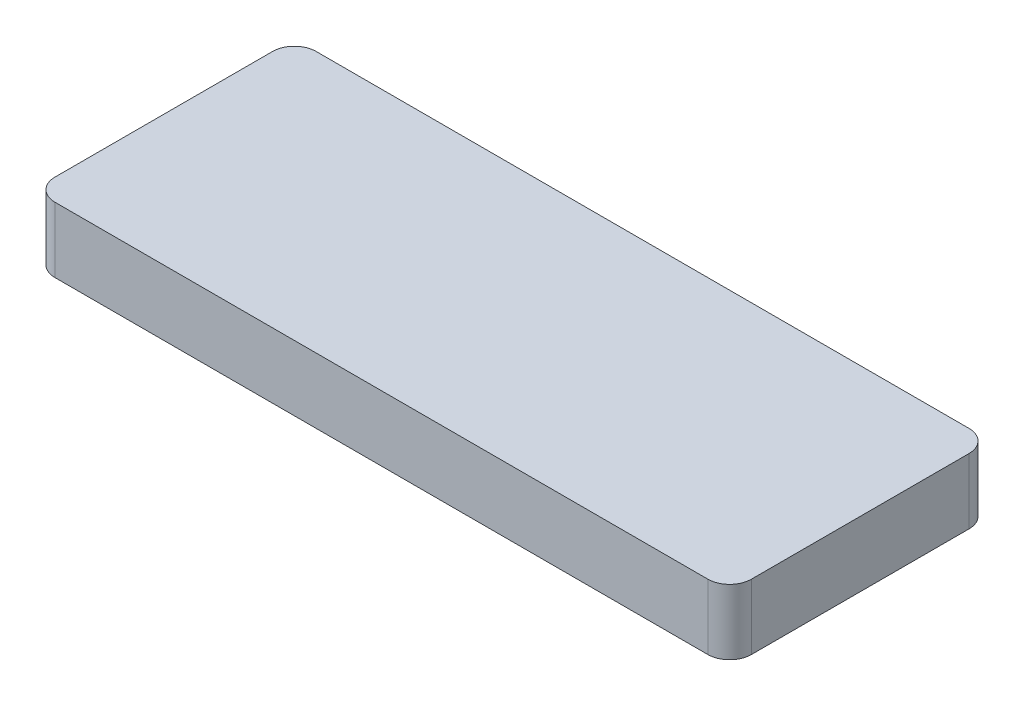
ISO-10303-21;
HEADER;
FILE_DESCRIPTION(('STEP AP214'),'2;1');
FILE_NAME('part.step','',(''),(''),'','','');
FILE_SCHEMA(('AUTOMOTIVE_DESIGN { 1 0 10303 214 1 1 1 1 }'));
ENDSEC;
DATA;
#1=APPLICATION_CONTEXT('core data for automotive mechanical design processes');
#2=APPLICATION_PROTOCOL_DEFINITION('international standard','automotive_design',2000,#1);
#3=PRODUCT_CONTEXT('',#1,'mechanical');
#4=PRODUCT('Part','Part','',(#3));
#5=PRODUCT_RELATED_PRODUCT_CATEGORY('part','',(#4));
#6=PRODUCT_DEFINITION_FORMATION('','',#4);
#7=PRODUCT_DEFINITION_CONTEXT('part definition',#1,'design');
#8=PRODUCT_DEFINITION('design','',#6,#7);
#9=PRODUCT_DEFINITION_SHAPE('','',#8);
#10=(LENGTH_UNIT() NAMED_UNIT(*) SI_UNIT(.MILLI.,.METRE.));
#11=(NAMED_UNIT(*) PLANE_ANGLE_UNIT() SI_UNIT($,.RADIAN.));
#12=(NAMED_UNIT(*) SI_UNIT($,.STERADIAN.) SOLID_ANGLE_UNIT());
#13=UNCERTAINTY_MEASURE_WITH_UNIT(LENGTH_MEASURE(1.E-05),#10,'distance_accuracy_value','');
#14=(GEOMETRIC_REPRESENTATION_CONTEXT(3) GLOBAL_UNCERTAINTY_ASSIGNED_CONTEXT((#13)) GLOBAL_UNIT_ASSIGNED_CONTEXT((#10,
#11,#12)) REPRESENTATION_CONTEXT('',''));
#15=CARTESIAN_POINT('',(0.,0.,0.));
#16=DIRECTION('',(0.,0.,1.));
#17=DIRECTION('',(1.,0.,0.));
#18=AXIS2_PLACEMENT_3D('',#15,#16,#17);
#19=CARTESIAN_POINT('',(95.25,19.05,31.75));
#20=DIRECTION('',(0.,-1.,0.));
#21=DIRECTION('',(0.,0.,-1.));
#22=AXIS2_PLACEMENT_3D('',#19,#20,#21);
#23=CYLINDRICAL_SURFACE('',#22,6.34999999999999);
#24=CARTESIAN_POINT('',(95.25,0.,31.75));
#25=DIRECTION('',(0.,1.,0.));
#26=DIRECTION('',(0.,0.,1.));
#27=AXIS2_PLACEMENT_3D('',#24,#25,#26);
#28=CIRCLE('',#27,6.34999999999999);
#29=CARTESIAN_POINT('',(95.2499999999999,0.,38.1));
#30=VERTEX_POINT('',#29);
#31=CARTESIAN_POINT('',(101.6,0.,31.75));
#32=VERTEX_POINT('',#31);
#33=EDGE_CURVE('E129',#30,#32,#28,.T.);
#34=ORIENTED_EDGE('',*,*,#33,.T.);
#35=DIRECTION('',(0.,-1.,0.));
#36=VECTOR('',#35,1.);
#37=CARTESIAN_POINT('',(101.6,19.05,31.75));
#38=LINE('',#37,#36);
#39=CARTESIAN_POINT('',(101.6,19.05,31.75));
#40=VERTEX_POINT('',#39);
#41=EDGE_CURVE('E11',#40,#32,#38,.T.);
#42=ORIENTED_EDGE('',*,*,#41,.F.);
#43=CARTESIAN_POINT('',(95.25,19.05,31.75));
#44=DIRECTION('',(0.,1.,0.));
#45=DIRECTION('',(0.,0.,1.));
#46=AXIS2_PLACEMENT_3D('',#43,#44,#45);
#47=CIRCLE('',#46,6.34999999999999);
#48=CARTESIAN_POINT('',(95.2499999999999,19.05,38.1));
#49=VERTEX_POINT('',#48);
#50=EDGE_CURVE('E143',#49,#40,#47,.T.);
#51=ORIENTED_EDGE('',*,*,#50,.F.);
#52=DIRECTION('',(0.,-1.,0.));
#53=VECTOR('',#52,1.);
#54=CARTESIAN_POINT('',(95.2499999999999,19.05,38.1));
#55=LINE('',#54,#53);
#56=EDGE_CURVE('E125',#49,#30,#55,.T.);
#57=ORIENTED_EDGE('',*,*,#56,.T.);
#58=EDGE_LOOP('',(#34,#42,#51,#57));
#59=FACE_BOUND('',#58,.T.);
#60=ADVANCED_FACE('F33',(#59),#23,.T.);
#61=CARTESIAN_POINT('',(101.6,19.05,31.75));
#62=DIRECTION('',(-1.,0.,0.));
#63=DIRECTION('',(0.,0.,1.));
#64=AXIS2_PLACEMENT_3D('',#61,#62,#63);
#65=PLANE('',#64);
#66=DIRECTION('',(0.,0.,-1.));
#67=VECTOR('',#66,1.);
#68=CARTESIAN_POINT('',(101.6,0.,31.75));
#69=LINE('',#68,#67);
#70=CARTESIAN_POINT('',(101.6,0.,-31.75));
#71=VERTEX_POINT('',#70);
#72=EDGE_CURVE('E132',#32,#71,#69,.T.);
#73=ORIENTED_EDGE('',*,*,#72,.T.);
#74=DIRECTION('',(0.,-1.,0.));
#75=VECTOR('',#74,1.);
#76=CARTESIAN_POINT('',(101.6,19.05,-31.75));
#77=LINE('',#76,#75);
#78=CARTESIAN_POINT('',(101.6,19.05,-31.75));
#79=VERTEX_POINT('',#78);
#80=EDGE_CURVE('E41',#79,#71,#77,.T.);
#81=ORIENTED_EDGE('',*,*,#80,.F.);
#82=DIRECTION('',(0.,0.,-1.));
#83=VECTOR('',#82,1.);
#84=CARTESIAN_POINT('',(101.6,19.05,31.75));
#85=LINE('',#84,#83);
#86=EDGE_CURVE('E92',#40,#79,#85,.T.);
#87=ORIENTED_EDGE('',*,*,#86,.F.);
#88=ORIENTED_EDGE('',*,*,#41,.T.);
#89=EDGE_LOOP('',(#73,#81,#87,#88));
#90=FACE_BOUND('',#89,.T.);
#91=ADVANCED_FACE('F178',(#90),#65,.F.);
#92=CARTESIAN_POINT('',(95.25,19.05,-31.75));
#93=DIRECTION('',(0.,-1.,0.));
#94=DIRECTION('',(0.,0.,-1.));
#95=AXIS2_PLACEMENT_3D('',#92,#93,#94);
#96=CYLINDRICAL_SURFACE('',#95,6.35);
#97=CARTESIAN_POINT('',(95.25,0.,-31.75));
#98=DIRECTION('',(0.,1.,0.));
#99=DIRECTION('',(0.,0.,-1.));
#100=AXIS2_PLACEMENT_3D('',#97,#98,#99);
#101=CIRCLE('',#100,6.35);
#102=CARTESIAN_POINT('',(95.2499999999999,0.,-38.1));
#103=VERTEX_POINT('',#102);
#104=EDGE_CURVE('E134',#71,#103,#101,.T.);
#105=ORIENTED_EDGE('',*,*,#104,.T.);
#106=DIRECTION('',(0.,-1.,0.));
#107=VECTOR('',#106,1.);
#108=CARTESIAN_POINT('',(95.2499999999999,19.05,-38.1));
#109=LINE('',#108,#107);
#110=CARTESIAN_POINT('',(95.2499999999999,19.05,-38.1));
#111=VERTEX_POINT('',#110);
#112=EDGE_CURVE('E150',#111,#103,#109,.T.);
#113=ORIENTED_EDGE('',*,*,#112,.F.);
#114=CARTESIAN_POINT('',(95.25,19.05,-31.75));
#115=DIRECTION('',(0.,1.,0.));
#116=DIRECTION('',(0.,0.,-1.));
#117=AXIS2_PLACEMENT_3D('',#114,#115,#116);
#118=CIRCLE('',#117,6.35);
#119=EDGE_CURVE('E158',#79,#111,#118,.T.);
#120=ORIENTED_EDGE('',*,*,#119,.F.);
#121=ORIENTED_EDGE('',*,*,#80,.T.);
#122=EDGE_LOOP('',(#105,#113,#120,#121));
#123=FACE_BOUND('',#122,.T.);
#124=ADVANCED_FACE('F156',(#123),#96,.T.);
#125=CARTESIAN_POINT('',(-95.25,19.05,-38.1));
#126=DIRECTION('',(0.,0.,1.));
#127=DIRECTION('',(1.,0.,0.));
#128=AXIS2_PLACEMENT_3D('',#125,#126,#127);
#129=PLANE('',#128);
#130=DIRECTION('',(-1.,0.,0.));
#131=VECTOR('',#130,1.);
#132=CARTESIAN_POINT('',(-95.25,0.,-38.1));
#133=LINE('',#132,#131);
#134=CARTESIAN_POINT('',(-95.25,0.,-38.1));
#135=VERTEX_POINT('',#134);
#136=EDGE_CURVE('E136',#103,#135,#133,.T.);
#137=ORIENTED_EDGE('',*,*,#136,.T.);
#138=DIRECTION('',(0.,-1.,0.));
#139=VECTOR('',#138,1.);
#140=CARTESIAN_POINT('',(-95.25,19.05,-38.1));
#141=LINE('',#140,#139);
#142=CARTESIAN_POINT('',(-95.25,19.05,-38.1));
#143=VERTEX_POINT('',#142);
#144=EDGE_CURVE('E147',#143,#135,#141,.T.);
#145=ORIENTED_EDGE('',*,*,#144,.F.);
#146=DIRECTION('',(-1.,0.,0.));
#147=VECTOR('',#146,1.);
#148=CARTESIAN_POINT('',(-95.25,19.05,-38.1));
#149=LINE('',#148,#147);
#150=EDGE_CURVE('E170',#111,#143,#149,.T.);
#151=ORIENTED_EDGE('',*,*,#150,.F.);
#152=ORIENTED_EDGE('',*,*,#112,.T.);
#153=EDGE_LOOP('',(#137,#145,#151,#152));
#154=FACE_BOUND('',#153,.T.);
#155=ADVANCED_FACE('F166',(#154),#129,.F.);
#156=CARTESIAN_POINT('',(-95.25,19.05,-31.75));
#157=DIRECTION('',(0.,-1.,0.));
#158=DIRECTION('',(0.,0.,-1.));
#159=AXIS2_PLACEMENT_3D('',#156,#157,#158);
#160=CYLINDRICAL_SURFACE('',#159,6.34999999999999);
#161=CARTESIAN_POINT('',(-95.25,0.,-31.75));
#162=DIRECTION('',(0.,1.,0.));
#163=DIRECTION('',(0.,0.,-1.));
#164=AXIS2_PLACEMENT_3D('',#161,#162,#163);
#165=CIRCLE('',#164,6.34999999999999);
#166=CARTESIAN_POINT('',(-101.6,0.,-31.75));
#167=VERTEX_POINT('',#166);
#168=EDGE_CURVE('E138',#135,#167,#165,.T.);
#169=ORIENTED_EDGE('',*,*,#168,.T.);
#170=DIRECTION('',(0.,-1.,0.));
#171=VECTOR('',#170,1.);
#172=CARTESIAN_POINT('',(-101.6,19.05,-31.75));
#173=LINE('',#172,#171);
#174=CARTESIAN_POINT('',(-101.6,19.05,-31.75));
#175=VERTEX_POINT('',#174);
#176=EDGE_CURVE('E120',#175,#167,#173,.T.);
#177=ORIENTED_EDGE('',*,*,#176,.F.);
#178=CARTESIAN_POINT('',(-95.25,19.05,-31.75));
#179=DIRECTION('',(0.,1.,0.));
#180=DIRECTION('',(0.,0.,-1.));
#181=AXIS2_PLACEMENT_3D('',#178,#179,#180);
#182=CIRCLE('',#181,6.34999999999999);
#183=EDGE_CURVE('E111',#143,#175,#182,.T.);
#184=ORIENTED_EDGE('',*,*,#183,.F.);
#185=ORIENTED_EDGE('',*,*,#144,.T.);
#186=EDGE_LOOP('',(#169,#177,#184,#185));
#187=FACE_BOUND('',#186,.T.);
#188=ADVANCED_FACE('F169',(#187),#160,.T.);
#189=CARTESIAN_POINT('',(-101.6,19.05,31.75));
#190=DIRECTION('',(1.,0.,0.));
#191=DIRECTION('',(0.,0.,-1.));
#192=AXIS2_PLACEMENT_3D('',#189,#190,#191);
#193=PLANE('',#192);
#194=DIRECTION('',(0.,0.,1.));
#195=VECTOR('',#194,1.);
#196=CARTESIAN_POINT('',(-101.6,0.,31.75));
#197=LINE('',#196,#195);
#198=CARTESIAN_POINT('',(-101.6,0.,31.75));
#199=VERTEX_POINT('',#198);
#200=EDGE_CURVE('E119',#167,#199,#197,.T.);
#201=ORIENTED_EDGE('',*,*,#200,.T.);
#202=DIRECTION('',(0.,-1.,0.));
#203=VECTOR('',#202,1.);
#204=CARTESIAN_POINT('',(-101.6,19.05,31.75));
#205=LINE('',#204,#203);
#206=CARTESIAN_POINT('',(-101.6,19.05,31.75));
#207=VERTEX_POINT('',#206);
#208=EDGE_CURVE('E116',#207,#199,#205,.T.);
#209=ORIENTED_EDGE('',*,*,#208,.F.);
#210=DIRECTION('',(0.,0.,1.));
#211=VECTOR('',#210,1.);
#212=CARTESIAN_POINT('',(-101.6,19.05,31.75));
#213=LINE('',#212,#211);
#214=EDGE_CURVE('E105',#175,#207,#213,.T.);
#215=ORIENTED_EDGE('',*,*,#214,.F.);
#216=ORIENTED_EDGE('',*,*,#176,.T.);
#217=EDGE_LOOP('',(#201,#209,#215,#216));
#218=FACE_BOUND('',#217,.T.);
#219=ADVANCED_FACE('F117',(#218),#193,.F.);
#220=CARTESIAN_POINT('',(-95.25,19.05,31.75));
#221=DIRECTION('',(0.,-1.,0.));
#222=DIRECTION('',(0.,0.,-1.));
#223=AXIS2_PLACEMENT_3D('',#220,#221,#222);
#224=CYLINDRICAL_SURFACE('',#223,6.35);
#225=CARTESIAN_POINT('',(-95.25,0.,31.75));
#226=DIRECTION('',(0.,1.,0.));
#227=DIRECTION('',(0.,0.,-1.));
#228=AXIS2_PLACEMENT_3D('',#225,#226,#227);
#229=CIRCLE('',#228,6.35);
#230=CARTESIAN_POINT('',(-95.25,0.,38.1));
#231=VERTEX_POINT('',#230);
#232=EDGE_CURVE('E78',#199,#231,#229,.T.);
#233=ORIENTED_EDGE('',*,*,#232,.T.);
#234=DIRECTION('',(0.,-1.,0.));
#235=VECTOR('',#234,1.);
#236=CARTESIAN_POINT('',(-95.25,19.05,38.1));
#237=LINE('',#236,#235);
#238=CARTESIAN_POINT('',(-95.25,19.05,38.1));
#239=VERTEX_POINT('',#238);
#240=EDGE_CURVE('E121',#239,#231,#237,.T.);
#241=ORIENTED_EDGE('',*,*,#240,.F.);
#242=CARTESIAN_POINT('',(-95.25,19.05,31.75));
#243=DIRECTION('',(0.,1.,0.));
#244=DIRECTION('',(0.,0.,-1.));
#245=AXIS2_PLACEMENT_3D('',#242,#243,#244);
#246=CIRCLE('',#245,6.35);
#247=EDGE_CURVE('E109',#207,#239,#246,.T.);
#248=ORIENTED_EDGE('',*,*,#247,.F.);
#249=ORIENTED_EDGE('',*,*,#208,.T.);
#250=EDGE_LOOP('',(#233,#241,#248,#249));
#251=FACE_BOUND('',#250,.T.);
#252=ADVANCED_FACE('F123',(#251),#224,.T.);
#253=CARTESIAN_POINT('',(-95.25,19.05,38.1));
#254=DIRECTION('',(0.,0.,-1.));
#255=DIRECTION('',(-1.,0.,0.));
#256=AXIS2_PLACEMENT_3D('',#253,#254,#255);
#257=PLANE('',#256);
#258=DIRECTION('',(1.,0.,0.));
#259=VECTOR('',#258,1.);
#260=CARTESIAN_POINT('',(-95.25,0.,38.1));
#261=LINE('',#260,#259);
#262=EDGE_CURVE('E84',#231,#30,#261,.T.);
#263=ORIENTED_EDGE('',*,*,#262,.T.);
#264=ORIENTED_EDGE('',*,*,#56,.F.);
#265=DIRECTION('',(1.,0.,0.));
#266=VECTOR('',#265,1.);
#267=CARTESIAN_POINT('',(-95.25,19.05,38.1));
#268=LINE('',#267,#266);
#269=EDGE_CURVE('E49',#239,#49,#268,.T.);
#270=ORIENTED_EDGE('',*,*,#269,.F.);
#271=ORIENTED_EDGE('',*,*,#240,.T.);
#272=EDGE_LOOP('',(#263,#264,#270,#271));
#273=FACE_BOUND('',#272,.T.);
#274=ADVANCED_FACE('F194',(#273),#257,.F.);
#275=CARTESIAN_POINT('',(95.25,19.05,31.75));
#276=DIRECTION('',(0.,1.,0.));
#277=DIRECTION('',(0.,0.,1.));
#278=AXIS2_PLACEMENT_3D('',#275,#276,#277);
#279=PLANE('',#278);
#280=ORIENTED_EDGE('',*,*,#50,.T.);
#281=ORIENTED_EDGE('',*,*,#86,.T.);
#282=ORIENTED_EDGE('',*,*,#119,.T.);
#283=ORIENTED_EDGE('',*,*,#150,.T.);
#284=ORIENTED_EDGE('',*,*,#183,.T.);
#285=ORIENTED_EDGE('',*,*,#214,.T.);
#286=ORIENTED_EDGE('',*,*,#247,.T.);
#287=ORIENTED_EDGE('',*,*,#269,.T.);
#288=EDGE_LOOP('',(#280,#281,#282,#283,#284,#285,#286,#287));
#289=FACE_BOUND('',#288,.T.);
#290=ADVANCED_FACE('F107',(#289),#279,.T.);
#291=CARTESIAN_POINT('',(95.25,0.,31.75));
#292=DIRECTION('',(0.,1.,0.));
#293=DIRECTION('',(0.,0.,1.));
#294=AXIS2_PLACEMENT_3D('',#291,#292,#293);
#295=PLANE('',#294);
#296=ORIENTED_EDGE('',*,*,#33,.F.);
#297=ORIENTED_EDGE('',*,*,#262,.F.);
#298=ORIENTED_EDGE('',*,*,#232,.F.);
#299=ORIENTED_EDGE('',*,*,#200,.F.);
#300=ORIENTED_EDGE('',*,*,#168,.F.);
#301=ORIENTED_EDGE('',*,*,#136,.F.);
#302=ORIENTED_EDGE('',*,*,#104,.F.);
#303=ORIENTED_EDGE('',*,*,#72,.F.);
#304=EDGE_LOOP('',(#296,#297,#298,#299,#300,#301,#302,#303));
#305=FACE_BOUND('',#304,.T.);
#306=ADVANCED_FACE('F162',(#305),#295,.F.);
#307=CLOSED_SHELL('',(#60,#91,#124,#155,#188,#219,#252,#274,#290,#306));
#308=MANIFOLD_SOLID_BREP('B2',#307);
#309=ADVANCED_BREP_SHAPE_REPRESENTATION('',(#18,#308),#14);
#310=SHAPE_DEFINITION_REPRESENTATION(#9,#309);
ENDSEC;
END-ISO-10303-21;
